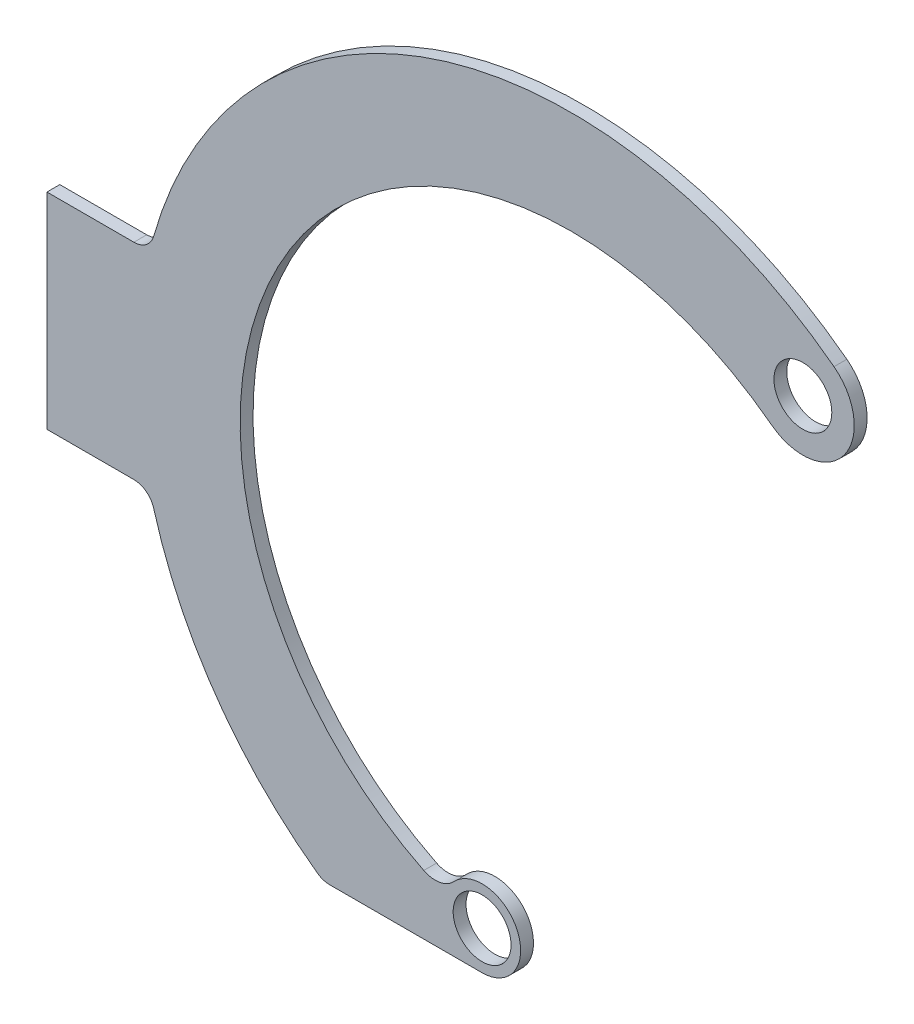
ISO-10303-21;
HEADER;
FILE_DESCRIPTION(('STEP AP214'),'2;1');
FILE_NAME('part.step','',(''),(''),'','','');
FILE_SCHEMA(('AUTOMOTIVE_DESIGN { 1 0 10303 214 1 1 1 1 }'));
ENDSEC;
DATA;
#1=APPLICATION_CONTEXT('core data for automotive mechanical design processes');
#2=APPLICATION_PROTOCOL_DEFINITION('international standard','automotive_design',2000,#1);
#3=PRODUCT_CONTEXT('',#1,'mechanical');
#4=PRODUCT('Part','Part','',(#3));
#5=PRODUCT_RELATED_PRODUCT_CATEGORY('part','',(#4));
#6=PRODUCT_DEFINITION_FORMATION('','',#4);
#7=PRODUCT_DEFINITION_CONTEXT('part definition',#1,'design');
#8=PRODUCT_DEFINITION('design','',#6,#7);
#9=PRODUCT_DEFINITION_SHAPE('','',#8);
#10=(LENGTH_UNIT() NAMED_UNIT(*) SI_UNIT(.MILLI.,.METRE.));
#11=(NAMED_UNIT(*) PLANE_ANGLE_UNIT() SI_UNIT($,.RADIAN.));
#12=(NAMED_UNIT(*) SI_UNIT($,.STERADIAN.) SOLID_ANGLE_UNIT());
#13=UNCERTAINTY_MEASURE_WITH_UNIT(LENGTH_MEASURE(1.E-05),#10,'distance_accuracy_value','');
#14=(GEOMETRIC_REPRESENTATION_CONTEXT(3) GLOBAL_UNCERTAINTY_ASSIGNED_CONTEXT((#13)) GLOBAL_UNIT_ASSIGNED_CONTEXT((#10,
#11,#12)) REPRESENTATION_CONTEXT('',''));
#15=CARTESIAN_POINT('',(0.,0.,0.));
#16=DIRECTION('',(0.,0.,1.));
#17=DIRECTION('',(1.,0.,0.));
#18=AXIS2_PLACEMENT_3D('',#15,#16,#17);
#19=CARTESIAN_POINT('',(0.,-19.05,6.35));
#20=DIRECTION('',(0.,-1.,0.));
#21=DIRECTION('',(1.,0.,0.));
#22=AXIS2_PLACEMENT_3D('',#19,#20,#21);
#23=PLANE('',#22);
#24=DIRECTION('',(-1.,0.,0.));
#25=VECTOR('',#24,1.);
#26=CARTESIAN_POINT('',(0.,-19.05,6.35));
#27=LINE('',#26,#25);
#28=CARTESIAN_POINT('',(0.,-19.05,6.35));
#29=VERTEX_POINT('',#28);
#30=CARTESIAN_POINT('',(-75.3888535056623,-19.05,6.35));
#31=VERTEX_POINT('',#30);
#32=EDGE_CURVE('E133',#29,#31,#27,.T.);
#33=ORIENTED_EDGE('',*,*,#32,.T.);
#34=DIRECTION('',(0.,0.,1.));
#35=VECTOR('',#34,1.);
#36=CARTESIAN_POINT('',(-75.3888535056623,-19.05,0.));
#37=LINE('',#36,#35);
#38=CARTESIAN_POINT('',(-75.3888535056623,-19.05,0.));
#39=VERTEX_POINT('',#38);
#40=EDGE_CURVE('E137',#31,#39,#37,.F.);
#41=ORIENTED_EDGE('',*,*,#40,.T.);
#42=DIRECTION('',(-1.,0.,0.));
#43=VECTOR('',#42,1.);
#44=CARTESIAN_POINT('',(0.,-19.05,0.));
#45=LINE('',#44,#43);
#46=CARTESIAN_POINT('',(0.,-19.05,0.));
#47=VERTEX_POINT('',#46);
#48=EDGE_CURVE('E136',#47,#39,#45,.T.);
#49=ORIENTED_EDGE('',*,*,#48,.F.);
#50=DIRECTION('',(0.,0.,-1.));
#51=VECTOR('',#50,1.);
#52=CARTESIAN_POINT('',(0.,-19.05,6.35));
#53=LINE('',#52,#51);
#54=EDGE_CURVE('E130',#29,#47,#53,.T.);
#55=ORIENTED_EDGE('',*,*,#54,.F.);
#56=EDGE_LOOP('',(#33,#41,#49,#55));
#57=FACE_BOUND('',#56,.T.);
#58=ADVANCED_FACE('F35',(#57),#23,.T.);
#59=CARTESIAN_POINT('',(0.,0.,6.35));
#60=DIRECTION('',(0.,0.,-1.));
#61=DIRECTION('',(-1.,0.,0.));
#62=AXIS2_PLACEMENT_3D('',#59,#60,#61);
#63=CYLINDRICAL_SURFACE('',#62,19.05);
#64=CARTESIAN_POINT('',(0.,0.,0.));
#65=DIRECTION('',(0.,0.,1.));
#66=DIRECTION('',(1.,0.,0.));
#67=AXIS2_PLACEMENT_3D('',#64,#65,#66);
#68=CIRCLE('',#67,19.05);
#69=CARTESIAN_POINT('',(-13.9075558480635,13.0185402535382,0.));
#70=VERTEX_POINT('',#69);
#71=EDGE_CURVE('E181',#47,#70,#68,.T.);
#72=ORIENTED_EDGE('',*,*,#71,.T.);
#73=DIRECTION('',(0.,0.,-1.));
#74=VECTOR('',#73,1.);
#75=CARTESIAN_POINT('',(-13.9075558480635,13.0185402535382,6.35));
#76=LINE('',#75,#74);
#77=CARTESIAN_POINT('',(-13.9075558480635,13.0185402535382,6.35));
#78=VERTEX_POINT('',#77);
#79=EDGE_CURVE('E50',#70,#78,#76,.F.);
#80=ORIENTED_EDGE('',*,*,#79,.T.);
#81=CARTESIAN_POINT('',(0.,0.,6.35));
#82=DIRECTION('',(0.,0.,1.));
#83=DIRECTION('',(1.,0.,0.));
#84=AXIS2_PLACEMENT_3D('',#81,#82,#83);
#85=CIRCLE('',#84,19.05);
#86=EDGE_CURVE('E140',#29,#78,#85,.T.);
#87=ORIENTED_EDGE('',*,*,#86,.F.);
#88=ORIENTED_EDGE('',*,*,#54,.T.);
#89=EDGE_LOOP('',(#72,#80,#87,#88));
#90=FACE_BOUND('',#89,.T.);
#91=ADVANCED_FACE('F141',(#90),#63,.T.);
#92=CARTESIAN_POINT('',(44.0107026212994,156.811497719101,6.35));
#93=DIRECTION('',(0.,0.,-1.));
#94=DIRECTION('',(-1.,0.,0.));
#95=AXIS2_PLACEMENT_3D('',#92,#93,#94);
#96=CYLINDRICAL_SURFACE('',#95,163.598195129287);
#97=CARTESIAN_POINT('',(44.0107026212994,156.811497719101,6.35));
#98=DIRECTION('',(0.,0.,1.));
#99=DIRECTION('',(1.,0.,0.));
#100=AXIS2_PLACEMENT_3D('',#97,#98,#99);
#101=CIRCLE('',#100,163.598195129287);
#102=CARTESIAN_POINT('',(143.154480854637,286.945585056658,6.35));
#103=VERTEX_POINT('',#102);
#104=CARTESIAN_POINT('',(-28.8341486030865,10.3260134564704,6.35));
#105=VERTEX_POINT('',#104);
#106=EDGE_CURVE('E144',#103,#105,#101,.T.);
#107=ORIENTED_EDGE('',*,*,#106,.T.);
#108=DIRECTION('',(0.,0.,-1.));
#109=VECTOR('',#108,1.);
#110=CARTESIAN_POINT('',(-28.8341486030865,10.3260134564704,6.35));
#111=LINE('',#110,#109);
#112=CARTESIAN_POINT('',(-28.8341486030865,10.3260134564704,0.));
#113=VERTEX_POINT('',#112);
#114=EDGE_CURVE('E233',#105,#113,#111,.T.);
#115=ORIENTED_EDGE('',*,*,#114,.T.);
#116=CARTESIAN_POINT('',(44.0107026212994,156.811497719101,0.));
#117=DIRECTION('',(0.,0.,1.));
#118=DIRECTION('',(1.,0.,0.));
#119=AXIS2_PLACEMENT_3D('',#116,#117,#118);
#120=CIRCLE('',#119,163.598195129287);
#121=CARTESIAN_POINT('',(143.154480854637,286.945585056658,0.));
#122=VERTEX_POINT('',#121);
#123=EDGE_CURVE('E183',#122,#113,#120,.T.);
#124=ORIENTED_EDGE('',*,*,#123,.F.);
#125=DIRECTION('',(0.,0.,-1.));
#126=VECTOR('',#125,1.);
#127=CARTESIAN_POINT('',(143.154480854637,286.945585056658,6.35));
#128=LINE('',#127,#126);
#129=EDGE_CURVE('E138',#103,#122,#128,.T.);
#130=ORIENTED_EDGE('',*,*,#129,.F.);
#131=EDGE_LOOP('',(#107,#115,#124,#130));
#132=FACE_BOUND('',#131,.T.);
#133=ADVANCED_FACE('F239',(#132),#96,.F.);
#134=CARTESIAN_POINT('',(158.547388857911,307.15,6.35));
#135=DIRECTION('',(0.,0.,-1.));
#136=DIRECTION('',(-1.,0.,0.));
#137=AXIS2_PLACEMENT_3D('',#134,#135,#136);
#138=CYLINDRICAL_SURFACE('',#137,25.4);
#139=CARTESIAN_POINT('',(158.547388857911,307.15,0.));
#140=DIRECTION('',(0.,0.,1.));
#141=DIRECTION('',(1.,0.,0.));
#142=AXIS2_PLACEMENT_3D('',#139,#140,#141);
#143=CIRCLE('',#142,25.4);
#144=CARTESIAN_POINT('',(173.940296861185,327.354414943342,0.));
#145=VERTEX_POINT('',#144);
#146=EDGE_CURVE('E185',#122,#145,#143,.T.);
#147=ORIENTED_EDGE('',*,*,#146,.T.);
#148=DIRECTION('',(0.,0.,-1.));
#149=VECTOR('',#148,1.);
#150=CARTESIAN_POINT('',(173.940296861185,327.354414943342,6.35));
#151=LINE('',#150,#149);
#152=CARTESIAN_POINT('',(173.940296861185,327.354414943342,6.35));
#153=VERTEX_POINT('',#152);
#154=EDGE_CURVE('E205',#153,#145,#151,.T.);
#155=ORIENTED_EDGE('',*,*,#154,.F.);
#156=CARTESIAN_POINT('',(158.547388857911,307.15,6.35));
#157=DIRECTION('',(0.,0.,1.));
#158=DIRECTION('',(1.,0.,0.));
#159=AXIS2_PLACEMENT_3D('',#156,#157,#158);
#160=CIRCLE('',#159,25.4);
#161=EDGE_CURVE('E159',#103,#153,#160,.T.);
#162=ORIENTED_EDGE('',*,*,#161,.F.);
#163=ORIENTED_EDGE('',*,*,#129,.T.);
#164=EDGE_LOOP('',(#147,#155,#162,#163));
#165=FACE_BOUND('',#164,.T.);
#166=ADVANCED_FACE('F248',(#165),#138,.T.);
#167=CARTESIAN_POINT('',(44.0107026212994,156.811497719101,6.35));
#168=DIRECTION('',(0.,0.,-1.));
#169=DIRECTION('',(-1.,0.,0.));
#170=AXIS2_PLACEMENT_3D('',#167,#168,#169);
#171=CYLINDRICAL_SURFACE('',#170,214.398195129287);
#172=CARTESIAN_POINT('',(44.0107026212994,156.811497719101,0.));
#173=DIRECTION('',(0.,0.,1.));
#174=DIRECTION('',(1.,0.,0.));
#175=AXIS2_PLACEMENT_3D('',#172,#173,#174);
#176=CIRCLE('',#175,214.398195129287);
#177=CARTESIAN_POINT('',(-162.336395069744,215.01339931328,0.));
#178=VERTEX_POINT('',#177);
#179=EDGE_CURVE('E187',#145,#178,#176,.T.);
#180=ORIENTED_EDGE('',*,*,#179,.T.);
#181=DIRECTION('',(0.,0.,-1.));
#182=VECTOR('',#181,1.);
#183=CARTESIAN_POINT('',(-162.336395069744,215.01339931328,6.35));
#184=LINE('',#183,#182);
#185=CARTESIAN_POINT('',(-162.336395069744,215.01339931328,6.35));
#186=VERTEX_POINT('',#185);
#187=EDGE_CURVE('E223',#178,#186,#184,.F.);
#188=ORIENTED_EDGE('',*,*,#187,.T.);
#189=CARTESIAN_POINT('',(44.0107026212994,156.811497719101,6.35));
#190=DIRECTION('',(0.,0.,1.));
#191=DIRECTION('',(1.,0.,0.));
#192=AXIS2_PLACEMENT_3D('',#189,#190,#191);
#193=CIRCLE('',#192,214.398195129287);
#194=EDGE_CURVE('E161',#153,#186,#193,.T.);
#195=ORIENTED_EDGE('',*,*,#194,.F.);
#196=ORIENTED_EDGE('',*,*,#154,.T.);
#197=EDGE_LOOP('',(#180,#188,#195,#196));
#198=FACE_BOUND('',#197,.T.);
#199=ADVANCED_FACE('F252',(#198),#171,.T.);
#200=CARTESIAN_POINT('',(0.,207.611497719101,6.35));
#201=DIRECTION('',(0.,1.,0.));
#202=DIRECTION('',(0.,0.,1.));
#203=AXIS2_PLACEMENT_3D('',#200,#201,#202);
#204=PLANE('',#203);
#205=DIRECTION('',(1.,0.,0.));
#206=VECTOR('',#205,1.);
#207=CARTESIAN_POINT('',(0.,207.611497719101,6.35));
#208=LINE('',#207,#206);
#209=CARTESIAN_POINT('',(-215.082230707452,207.611497719101,6.35));
#210=VERTEX_POINT('',#209);
#211=CARTESIAN_POINT('',(-172.114865971875,207.611497719101,6.35));
#212=VERTEX_POINT('',#211);
#213=EDGE_CURVE('E164',#210,#212,#208,.T.);
#214=ORIENTED_EDGE('',*,*,#213,.T.);
#215=DIRECTION('',(0.,0.,-1.));
#216=VECTOR('',#215,1.);
#217=CARTESIAN_POINT('',(-172.114865971875,207.611497719101,6.35));
#218=LINE('',#217,#216);
#219=CARTESIAN_POINT('',(-172.114865971875,207.611497719101,0.));
#220=VERTEX_POINT('',#219);
#221=EDGE_CURVE('E220',#212,#220,#218,.T.);
#222=ORIENTED_EDGE('',*,*,#221,.T.);
#223=DIRECTION('',(1.,0.,0.));
#224=VECTOR('',#223,1.);
#225=CARTESIAN_POINT('',(0.,207.611497719101,0.));
#226=LINE('',#225,#224);
#227=CARTESIAN_POINT('',(-215.082230707452,207.611497719101,0.));
#228=VERTEX_POINT('',#227);
#229=EDGE_CURVE('E190',#228,#220,#226,.T.);
#230=ORIENTED_EDGE('',*,*,#229,.F.);
#231=DIRECTION('',(0.,0.,-1.));
#232=VECTOR('',#231,1.);
#233=CARTESIAN_POINT('',(-215.082230707452,207.611497719101,6.35));
#234=LINE('',#233,#232);
#235=EDGE_CURVE('E203',#210,#228,#234,.T.);
#236=ORIENTED_EDGE('',*,*,#235,.F.);
#237=EDGE_LOOP('',(#214,#222,#230,#236));
#238=FACE_BOUND('',#237,.T.);
#239=ADVANCED_FACE('F261',(#238),#204,.T.);
#240=CARTESIAN_POINT('',(-215.082230707452,0.,6.35));
#241=DIRECTION('',(1.,0.,0.));
#242=DIRECTION('',(0.,0.,-1.));
#243=AXIS2_PLACEMENT_3D('',#240,#241,#242);
#244=PLANE('',#243);
#245=DIRECTION('',(0.,-1.,0.));
#246=VECTOR('',#245,1.);
#247=CARTESIAN_POINT('',(-215.082230707452,0.,0.));
#248=LINE('',#247,#246);
#249=CARTESIAN_POINT('',(-215.082230707452,106.011497719101,0.));
#250=VERTEX_POINT('',#249);
#251=EDGE_CURVE('E194',#228,#250,#248,.T.);
#252=ORIENTED_EDGE('',*,*,#251,.T.);
#253=DIRECTION('',(0.,0.,-1.));
#254=VECTOR('',#253,1.);
#255=CARTESIAN_POINT('',(-215.082230707452,106.011497719101,6.35));
#256=LINE('',#255,#254);
#257=CARTESIAN_POINT('',(-215.082230707452,106.011497719101,6.35));
#258=VERTEX_POINT('',#257);
#259=EDGE_CURVE('E179',#258,#250,#256,.T.);
#260=ORIENTED_EDGE('',*,*,#259,.F.);
#261=DIRECTION('',(0.,-1.,0.));
#262=VECTOR('',#261,1.);
#263=CARTESIAN_POINT('',(-215.082230707452,0.,6.35));
#264=LINE('',#263,#262);
#265=EDGE_CURVE('E168',#210,#258,#264,.T.);
#266=ORIENTED_EDGE('',*,*,#265,.F.);
#267=ORIENTED_EDGE('',*,*,#235,.T.);
#268=EDGE_LOOP('',(#252,#260,#266,#267));
#269=FACE_BOUND('',#268,.T.);
#270=ADVANCED_FACE('F266',(#269),#244,.F.);
#271=CARTESIAN_POINT('',(0.,106.011497719101,6.35));
#272=DIRECTION('',(0.,1.,0.));
#273=DIRECTION('',(0.,0.,1.));
#274=AXIS2_PLACEMENT_3D('',#271,#272,#273);
#275=PLANE('',#274);
#276=DIRECTION('',(1.,0.,0.));
#277=VECTOR('',#276,1.);
#278=CARTESIAN_POINT('',(0.,106.011497719101,0.));
#279=LINE('',#278,#277);
#280=CARTESIAN_POINT('',(-172.114865971875,106.011497719101,0.));
#281=VERTEX_POINT('',#280);
#282=EDGE_CURVE('E196',#250,#281,#279,.T.);
#283=ORIENTED_EDGE('',*,*,#282,.T.);
#284=DIRECTION('',(0.,0.,1.));
#285=VECTOR('',#284,1.);
#286=CARTESIAN_POINT('',(-172.114865971875,106.011497719101,6.35));
#287=LINE('',#286,#285);
#288=CARTESIAN_POINT('',(-172.114865971875,106.011497719101,6.35));
#289=VERTEX_POINT('',#288);
#290=EDGE_CURVE('E218',#281,#289,#287,.T.);
#291=ORIENTED_EDGE('',*,*,#290,.T.);
#292=DIRECTION('',(1.,0.,0.));
#293=VECTOR('',#292,1.);
#294=CARTESIAN_POINT('',(0.,106.011497719101,6.35));
#295=LINE('',#294,#293);
#296=EDGE_CURVE('E170',#258,#289,#295,.T.);
#297=ORIENTED_EDGE('',*,*,#296,.F.);
#298=ORIENTED_EDGE('',*,*,#259,.T.);
#299=EDGE_LOOP('',(#283,#291,#297,#298));
#300=FACE_BOUND('',#299,.T.);
#301=ADVANCED_FACE('F270',(#300),#275,.F.);
#302=CARTESIAN_POINT('',(158.547388857911,307.15,6.35));
#303=DIRECTION('',(0.,0.,-1.));
#304=DIRECTION('',(-1.,0.,0.));
#305=AXIS2_PLACEMENT_3D('',#302,#303,#304);
#306=CYLINDRICAL_SURFACE('',#305,14.3002);
#307=CARTESIAN_POINT('',(158.547388857911,307.15,6.35));
#308=DIRECTION('',(0.,0.,1.));
#309=DIRECTION('',(1.,0.,0.));
#310=AXIS2_PLACEMENT_3D('',#307,#308,#309);
#311=CIRCLE('',#310,14.3002);
#312=CARTESIAN_POINT('',(172.847588857911,307.15,6.35));
#313=VERTEX_POINT('',#312);
#314=EDGE_CURVE('E173',#313,#313,#311,.T.);
#315=ORIENTED_EDGE('',*,*,#314,.T.);
#316=EDGE_LOOP('',(#315));
#317=FACE_BOUND('',#316,.T.);
#318=CARTESIAN_POINT('',(158.547388857911,307.15,0.));
#319=DIRECTION('',(0.,0.,1.));
#320=DIRECTION('',(1.,0.,0.));
#321=AXIS2_PLACEMENT_3D('',#318,#319,#320);
#322=CIRCLE('',#321,14.3002);
#323=CARTESIAN_POINT('',(172.847588857911,307.15,0.));
#324=VERTEX_POINT('',#323);
#325=EDGE_CURVE('E154',#324,#324,#322,.T.);
#326=ORIENTED_EDGE('',*,*,#325,.F.);
#327=EDGE_LOOP('',(#326));
#328=FACE_BOUND('',#327,.T.);
#329=ADVANCED_FACE('F309',(#317,#328),#306,.F.);
#330=CARTESIAN_POINT('',(-162.336395069744,98.6095961249211,0.));
#331=VERTEX_POINT('',#330);
#332=CARTESIAN_POINT('',(-81.3284843836282,-17.1329597253362,0.));
#333=VERTEX_POINT('',#332);
#334=EDGE_CURVE('E191',#331,#333,#176,.T.);
#335=ORIENTED_EDGE('',*,*,#334,.T.);
#336=DIRECTION('',(0.,0.,-1.));
#337=VECTOR('',#336,1.);
#338=CARTESIAN_POINT('',(-81.3284843836282,-17.1329597253363,6.35));
#339=LINE('',#338,#337);
#340=CARTESIAN_POINT('',(-81.3284843836282,-17.1329597253362,6.35));
#341=VERTEX_POINT('',#340);
#342=EDGE_CURVE('E215',#333,#341,#339,.F.);
#343=ORIENTED_EDGE('',*,*,#342,.T.);
#344=CARTESIAN_POINT('',(-162.336395069744,98.6095961249211,6.35));
#345=VERTEX_POINT('',#344);
#346=EDGE_CURVE('E165',#345,#341,#193,.T.);
#347=ORIENTED_EDGE('',*,*,#346,.F.);
#348=DIRECTION('',(0.,0.,-1.));
#349=VECTOR('',#348,1.);
#350=CARTESIAN_POINT('',(-162.336395069744,98.6095961249211,6.35));
#351=LINE('',#350,#349);
#352=EDGE_CURVE('E212',#345,#331,#351,.T.);
#353=ORIENTED_EDGE('',*,*,#352,.T.);
#354=EDGE_LOOP('',(#335,#343,#347,#353));
#355=FACE_BOUND('',#354,.T.);
#356=ADVANCED_FACE('F280',(#355),#171,.T.);
#357=CARTESIAN_POINT('',(0.,0.,6.35));
#358=DIRECTION('',(0.,0.,-1.));
#359=DIRECTION('',(-1.,0.,0.));
#360=AXIS2_PLACEMENT_3D('',#357,#358,#359);
#361=CYLINDRICAL_SURFACE('',#360,14.3002);
#362=CARTESIAN_POINT('',(0.,0.,6.35));
#363=DIRECTION('',(0.,0.,1.));
#364=DIRECTION('',(1.,0.,0.));
#365=AXIS2_PLACEMENT_3D('',#362,#363,#364);
#366=CIRCLE('',#365,14.3002);
#367=CARTESIAN_POINT('',(14.3002,0.,6.35));
#368=VERTEX_POINT('',#367);
#369=EDGE_CURVE('E176',#368,#368,#366,.F.);
#370=ORIENTED_EDGE('',*,*,#369,.F.);
#371=EDGE_LOOP('',(#370));
#372=FACE_BOUND('',#371,.T.);
#373=CARTESIAN_POINT('',(0.,0.,0.));
#374=DIRECTION('',(0.,0.,1.));
#375=DIRECTION('',(1.,0.,0.));
#376=AXIS2_PLACEMENT_3D('',#373,#374,#375);
#377=CIRCLE('',#376,14.3002);
#378=CARTESIAN_POINT('',(14.3002,0.,0.));
#379=VERTEX_POINT('',#378);
#380=EDGE_CURVE('E151',#379,#379,#377,.F.);
#381=ORIENTED_EDGE('',*,*,#380,.T.);
#382=EDGE_LOOP('',(#381));
#383=FACE_BOUND('',#382,.T.);
#384=ADVANCED_FACE('F312',(#372,#383),#361,.F.);
#385=CARTESIAN_POINT('',(0.,0.,6.35));
#386=DIRECTION('',(0.,0.,1.));
#387=DIRECTION('',(1.,0.,0.));
#388=AXIS2_PLACEMENT_3D('',#385,#386,#387);
#389=PLANE('',#388);
#390=ORIENTED_EDGE('',*,*,#346,.T.);
#391=CARTESIAN_POINT('',(-75.3888535056623,-8.89000000000004,6.35));
#392=DIRECTION('',(0.,0.,1.));
#393=DIRECTION('',(1.,0.,0.));
#394=AXIS2_PLACEMENT_3D('',#391,#392,#393);
#395=CIRCLE('',#394,10.16);
#396=EDGE_CURVE('E150',#341,#31,#395,.T.);
#397=ORIENTED_EDGE('',*,*,#396,.T.);
#398=ORIENTED_EDGE('',*,*,#32,.F.);
#399=ORIENTED_EDGE('',*,*,#86,.T.);
#400=CARTESIAN_POINT('',(-23.1792597467724,21.6975670892304,6.35));
#401=DIRECTION('',(0.,0.,1.));
#402=DIRECTION('',(1.,0.,0.));
#403=AXIS2_PLACEMENT_3D('',#400,#401,#402);
#404=CIRCLE('',#403,12.7);
#405=EDGE_CURVE('E11',#78,#105,#404,.F.);
#406=ORIENTED_EDGE('',*,*,#405,.T.);
#407=ORIENTED_EDGE('',*,*,#106,.F.);
#408=ORIENTED_EDGE('',*,*,#161,.T.);
#409=ORIENTED_EDGE('',*,*,#194,.T.);
#410=CARTESIAN_POINT('',(-172.114865971875,217.771497719101,6.35));
#411=DIRECTION('',(0.,0.,1.));
#412=DIRECTION('',(1.,0.,0.));
#413=AXIS2_PLACEMENT_3D('',#410,#411,#412);
#414=CIRCLE('',#413,10.16);
#415=EDGE_CURVE('E231',#186,#212,#414,.F.);
#416=ORIENTED_EDGE('',*,*,#415,.T.);
#417=ORIENTED_EDGE('',*,*,#213,.F.);
#418=ORIENTED_EDGE('',*,*,#265,.T.);
#419=ORIENTED_EDGE('',*,*,#296,.T.);
#420=CARTESIAN_POINT('',(-172.114865971875,95.8514977191007,6.35));
#421=DIRECTION('',(0.,0.,1.));
#422=DIRECTION('',(1.,0.,0.));
#423=AXIS2_PLACEMENT_3D('',#420,#421,#422);
#424=CIRCLE('',#423,10.16);
#425=EDGE_CURVE('E227',#289,#345,#424,.F.);
#426=ORIENTED_EDGE('',*,*,#425,.T.);
#427=EDGE_LOOP('',(#390,#397,#398,#399,#406,#407,#408,#409,#416,#417,#418,#419,#426));
#428=FACE_BOUND('',#427,.T.);
#429=ORIENTED_EDGE('',*,*,#314,.F.);
#430=EDGE_LOOP('',(#429));
#431=FACE_BOUND('',#430,.T.);
#432=ORIENTED_EDGE('',*,*,#369,.T.);
#433=EDGE_LOOP('',(#432));
#434=FACE_BOUND('',#433,.T.);
#435=ADVANCED_FACE('F147',(#428,#431,#434),#389,.T.);
#436=CARTESIAN_POINT('',(0.,0.,0.));
#437=DIRECTION('',(0.,0.,1.));
#438=DIRECTION('',(1.,0.,0.));
#439=AXIS2_PLACEMENT_3D('',#436,#437,#438);
#440=PLANE('',#439);
#441=ORIENTED_EDGE('',*,*,#48,.T.);
#442=CARTESIAN_POINT('',(-75.3888535056623,-8.89000000000004,0.));
#443=DIRECTION('',(0.,0.,1.));
#444=DIRECTION('',(1.,0.,0.));
#445=AXIS2_PLACEMENT_3D('',#442,#443,#444);
#446=CIRCLE('',#445,10.16);
#447=EDGE_CURVE('E210',#39,#333,#446,.F.);
#448=ORIENTED_EDGE('',*,*,#447,.T.);
#449=ORIENTED_EDGE('',*,*,#334,.F.);
#450=CARTESIAN_POINT('',(-172.114865971875,95.8514977191007,0.));
#451=DIRECTION('',(0.,0.,1.));
#452=DIRECTION('',(1.,0.,0.));
#453=AXIS2_PLACEMENT_3D('',#450,#451,#452);
#454=CIRCLE('',#453,10.16);
#455=EDGE_CURVE('E225',#331,#281,#454,.T.);
#456=ORIENTED_EDGE('',*,*,#455,.T.);
#457=ORIENTED_EDGE('',*,*,#282,.F.);
#458=ORIENTED_EDGE('',*,*,#251,.F.);
#459=ORIENTED_EDGE('',*,*,#229,.T.);
#460=CARTESIAN_POINT('',(-172.114865971875,217.771497719101,0.));
#461=DIRECTION('',(0.,0.,1.));
#462=DIRECTION('',(1.,0.,0.));
#463=AXIS2_PLACEMENT_3D('',#460,#461,#462);
#464=CIRCLE('',#463,10.16);
#465=EDGE_CURVE('E229',#220,#178,#464,.T.);
#466=ORIENTED_EDGE('',*,*,#465,.T.);
#467=ORIENTED_EDGE('',*,*,#179,.F.);
#468=ORIENTED_EDGE('',*,*,#146,.F.);
#469=ORIENTED_EDGE('',*,*,#123,.T.);
#470=CARTESIAN_POINT('',(-23.1792597467724,21.6975670892304,0.));
#471=DIRECTION('',(0.,0.,1.));
#472=DIRECTION('',(1.,0.,0.));
#473=AXIS2_PLACEMENT_3D('',#470,#471,#472);
#474=CIRCLE('',#473,12.7);
#475=EDGE_CURVE('E43',#113,#70,#474,.T.);
#476=ORIENTED_EDGE('',*,*,#475,.T.);
#477=ORIENTED_EDGE('',*,*,#71,.F.);
#478=EDGE_LOOP('',(#441,#448,#449,#456,#457,#458,#459,#466,#467,#468,#469,#476,#477));
#479=FACE_BOUND('',#478,.T.);
#480=ORIENTED_EDGE('',*,*,#325,.T.);
#481=EDGE_LOOP('',(#480));
#482=FACE_BOUND('',#481,.T.);
#483=ORIENTED_EDGE('',*,*,#380,.F.);
#484=EDGE_LOOP('',(#483));
#485=FACE_BOUND('',#484,.T.);
#486=ADVANCED_FACE('F243',(#479,#482,#485),#440,.F.);
#487=CARTESIAN_POINT('',(-75.3888535056623,-8.89000000000004,6.35));
#488=DIRECTION('',(0.,0.,-1.));
#489=DIRECTION('',(-1.,0.,0.));
#490=AXIS2_PLACEMENT_3D('',#487,#488,#489);
#491=CYLINDRICAL_SURFACE('',#490,10.16);
#492=ORIENTED_EDGE('',*,*,#396,.F.);
#493=ORIENTED_EDGE('',*,*,#342,.F.);
#494=ORIENTED_EDGE('',*,*,#447,.F.);
#495=ORIENTED_EDGE('',*,*,#40,.F.);
#496=EDGE_LOOP('',(#492,#493,#494,#495));
#497=FACE_BOUND('',#496,.T.);
#498=ADVANCED_FACE('F283',(#497),#491,.T.);
#499=CARTESIAN_POINT('',(-172.114865971875,95.8514977191007,6.35));
#500=DIRECTION('',(0.,0.,-1.));
#501=DIRECTION('',(-1.,0.,0.));
#502=AXIS2_PLACEMENT_3D('',#499,#500,#501);
#503=CYLINDRICAL_SURFACE('',#502,10.16);
#504=ORIENTED_EDGE('',*,*,#425,.F.);
#505=ORIENTED_EDGE('',*,*,#290,.F.);
#506=ORIENTED_EDGE('',*,*,#455,.F.);
#507=ORIENTED_EDGE('',*,*,#352,.F.);
#508=EDGE_LOOP('',(#504,#505,#506,#507));
#509=FACE_BOUND('',#508,.T.);
#510=ADVANCED_FACE('F276',(#509),#503,.F.);
#511=CARTESIAN_POINT('',(-172.114865971875,217.771497719101,6.35));
#512=DIRECTION('',(0.,0.,-1.));
#513=DIRECTION('',(-1.,0.,0.));
#514=AXIS2_PLACEMENT_3D('',#511,#512,#513);
#515=CYLINDRICAL_SURFACE('',#514,10.16);
#516=ORIENTED_EDGE('',*,*,#415,.F.);
#517=ORIENTED_EDGE('',*,*,#187,.F.);
#518=ORIENTED_EDGE('',*,*,#465,.F.);
#519=ORIENTED_EDGE('',*,*,#221,.F.);
#520=EDGE_LOOP('',(#516,#517,#518,#519));
#521=FACE_BOUND('',#520,.T.);
#522=ADVANCED_FACE('F258',(#521),#515,.F.);
#523=CARTESIAN_POINT('',(-23.1792597467724,21.6975670892304,6.35));
#524=DIRECTION('',(0.,0.,-1.));
#525=DIRECTION('',(-1.,0.,0.));
#526=AXIS2_PLACEMENT_3D('',#523,#524,#525);
#527=CYLINDRICAL_SURFACE('',#526,12.7);
#528=ORIENTED_EDGE('',*,*,#405,.F.);
#529=ORIENTED_EDGE('',*,*,#79,.F.);
#530=ORIENTED_EDGE('',*,*,#475,.F.);
#531=ORIENTED_EDGE('',*,*,#114,.F.);
#532=EDGE_LOOP('',(#528,#529,#530,#531));
#533=FACE_BOUND('',#532,.T.);
#534=ADVANCED_FACE('F37',(#533),#527,.F.);
#535=CLOSED_SHELL('',(#58,#91,#133,#166,#199,#239,#270,#301,#329,#356,#384,#435,#486,#498,#510,
#522,#534));
#536=MANIFOLD_SOLID_BREP('B2',#535);
#537=ADVANCED_BREP_SHAPE_REPRESENTATION('',(#18,#536),#14);
#538=SHAPE_DEFINITION_REPRESENTATION(#9,#537);
ENDSEC;
END-ISO-10303-21;
